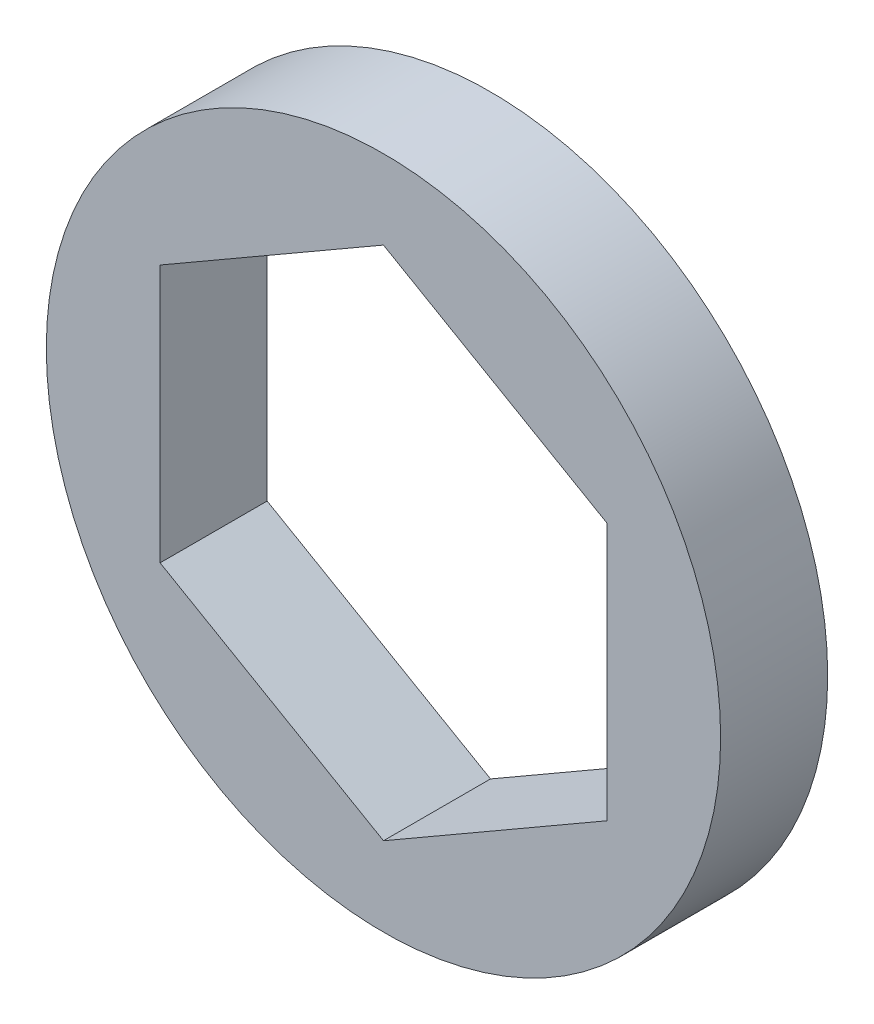
ISO-10303-21;
HEADER;
FILE_DESCRIPTION(('STEP AP214'),'2;1');
FILE_NAME('part.step','',(''),(''),'','','');
FILE_SCHEMA(('AUTOMOTIVE_DESIGN { 1 0 10303 214 1 1 1 1 }'));
ENDSEC;
DATA;
#1=APPLICATION_CONTEXT('core data for automotive mechanical design processes');
#2=APPLICATION_PROTOCOL_DEFINITION('international standard','automotive_design',2000,#1);
#3=PRODUCT_CONTEXT('',#1,'mechanical');
#4=PRODUCT('Part','Part','',(#3));
#5=PRODUCT_RELATED_PRODUCT_CATEGORY('part','',(#4));
#6=PRODUCT_DEFINITION_FORMATION('','',#4);
#7=PRODUCT_DEFINITION_CONTEXT('part definition',#1,'design');
#8=PRODUCT_DEFINITION('design','',#6,#7);
#9=PRODUCT_DEFINITION_SHAPE('','',#8);
#10=(LENGTH_UNIT() NAMED_UNIT(*) SI_UNIT(.MILLI.,.METRE.));
#11=(NAMED_UNIT(*) PLANE_ANGLE_UNIT() SI_UNIT($,.RADIAN.));
#12=(NAMED_UNIT(*) SI_UNIT($,.STERADIAN.) SOLID_ANGLE_UNIT());
#13=UNCERTAINTY_MEASURE_WITH_UNIT(LENGTH_MEASURE(1.E-05),#10,'distance_accuracy_value','');
#14=(GEOMETRIC_REPRESENTATION_CONTEXT(3) GLOBAL_UNCERTAINTY_ASSIGNED_CONTEXT((#13)) GLOBAL_UNIT_ASSIGNED_CONTEXT((#10,
#11,#12)) REPRESENTATION_CONTEXT('',''));
#15=CARTESIAN_POINT('',(0.,0.,0.));
#16=DIRECTION('',(0.,0.,1.));
#17=DIRECTION('',(1.,0.,0.));
#18=AXIS2_PLACEMENT_3D('',#15,#16,#17);
#19=CARTESIAN_POINT('',(0.,0.,1.6129));
#20=DIRECTION('',(0.,0.,1.));
#21=DIRECTION('',(1.,0.,0.));
#22=AXIS2_PLACEMENT_3D('',#19,#20,#21);
#23=PLANE('',#22);
#24=CARTESIAN_POINT('',(0.,0.,1.6129));
#25=DIRECTION('',(0.,0.,1.));
#26=DIRECTION('',(1.,0.,0.));
#27=AXIS2_PLACEMENT_3D('',#24,#25,#26);
#28=CIRCLE('',#27,10.16);
#29=CARTESIAN_POINT('',(10.16,0.,1.6129));
#30=VERTEX_POINT('',#29);
#31=EDGE_CURVE('E11',#30,#30,#28,.T.);
#32=ORIENTED_EDGE('',*,*,#31,.T.);
#33=EDGE_LOOP('',(#32));
#34=FACE_BOUND('',#33,.T.);
#35=DIRECTION('',(-0.866025403784439,-0.5,0.));
#36=VECTOR('',#35,1.);
#37=CARTESIAN_POINT('',(0.,7.77228932383074,1.6129));
#38=LINE('',#37,#36);
#39=CARTESIAN_POINT('',(0.,7.77228932383074,1.6129));
#40=VERTEX_POINT('',#39);
#41=CARTESIAN_POINT('',(-6.731,3.88614466191537,1.6129));
#42=VERTEX_POINT('',#41);
#43=EDGE_CURVE('E98',#40,#42,#38,.T.);
#44=ORIENTED_EDGE('',*,*,#43,.F.);
#45=DIRECTION('',(-0.866025403784439,0.5,0.));
#46=VECTOR('',#45,1.);
#47=CARTESIAN_POINT('',(6.731,3.88614466191537,1.6129));
#48=LINE('',#47,#46);
#49=CARTESIAN_POINT('',(6.731,3.88614466191537,1.6129));
#50=VERTEX_POINT('',#49);
#51=EDGE_CURVE('E90',#50,#40,#48,.T.);
#52=ORIENTED_EDGE('',*,*,#51,.F.);
#53=DIRECTION('',(0.,1.,0.));
#54=VECTOR('',#53,1.);
#55=CARTESIAN_POINT('',(6.731,-3.88614466191537,1.6129));
#56=LINE('',#55,#54);
#57=CARTESIAN_POINT('',(6.731,-3.88614466191537,1.6129));
#58=VERTEX_POINT('',#57);
#59=EDGE_CURVE('E118',#58,#50,#56,.T.);
#60=ORIENTED_EDGE('',*,*,#59,.F.);
#61=DIRECTION('',(0.866025403784439,0.5,0.));
#62=VECTOR('',#61,1.);
#63=CARTESIAN_POINT('',(0.,-7.77228932383074,1.6129));
#64=LINE('',#63,#62);
#65=CARTESIAN_POINT('',(0.,-7.77228932383074,1.6129));
#66=VERTEX_POINT('',#65);
#67=EDGE_CURVE('E116',#66,#58,#64,.T.);
#68=ORIENTED_EDGE('',*,*,#67,.F.);
#69=DIRECTION('',(0.866025403784439,-0.5,0.));
#70=VECTOR('',#69,1.);
#71=CARTESIAN_POINT('',(-6.731,-3.88614466191537,1.6129));
#72=LINE('',#71,#70);
#73=CARTESIAN_POINT('',(-6.731,-3.88614466191537,1.6129));
#74=VERTEX_POINT('',#73);
#75=EDGE_CURVE('E112',#74,#66,#72,.T.);
#76=ORIENTED_EDGE('',*,*,#75,.F.);
#77=DIRECTION('',(0.,-1.,0.));
#78=VECTOR('',#77,1.);
#79=CARTESIAN_POINT('',(-6.731,3.88614466191537,1.6129));
#80=LINE('',#79,#78);
#81=EDGE_CURVE('E110',#42,#74,#80,.T.);
#82=ORIENTED_EDGE('',*,*,#81,.F.);
#83=EDGE_LOOP('',(#44,#52,#60,#68,#76,#82));
#84=FACE_BOUND('',#83,.T.);
#85=ADVANCED_FACE('F37',(#34,#84),#23,.T.);
#86=CARTESIAN_POINT('',(0.,0.,-1.6129));
#87=DIRECTION('',(0.,0.,1.));
#88=DIRECTION('',(1.,0.,0.));
#89=AXIS2_PLACEMENT_3D('',#86,#87,#88);
#90=PLANE('',#89);
#91=CARTESIAN_POINT('',(0.,0.,-1.6129));
#92=DIRECTION('',(0.,0.,1.));
#93=DIRECTION('',(1.,0.,0.));
#94=AXIS2_PLACEMENT_3D('',#91,#92,#93);
#95=CIRCLE('',#94,10.16);
#96=CARTESIAN_POINT('',(10.16,0.,-1.6129));
#97=VERTEX_POINT('',#96);
#98=EDGE_CURVE('E41',#97,#97,#95,.T.);
#99=ORIENTED_EDGE('',*,*,#98,.F.);
#100=EDGE_LOOP('',(#99));
#101=FACE_BOUND('',#100,.T.);
#102=DIRECTION('',(-0.866025403784439,0.5,0.));
#103=VECTOR('',#102,1.);
#104=CARTESIAN_POINT('',(6.731,3.88614466191537,-1.6129));
#105=LINE('',#104,#103);
#106=CARTESIAN_POINT('',(6.731,3.88614466191537,-1.6129));
#107=VERTEX_POINT('',#106);
#108=CARTESIAN_POINT('',(0.,7.77228932383074,-1.6129));
#109=VERTEX_POINT('',#108);
#110=EDGE_CURVE('E60',#107,#109,#105,.T.);
#111=ORIENTED_EDGE('',*,*,#110,.T.);
#112=DIRECTION('',(-0.866025403784439,-0.5,0.));
#113=VECTOR('',#112,1.);
#114=CARTESIAN_POINT('',(0.,7.77228932383074,-1.6129));
#115=LINE('',#114,#113);
#116=CARTESIAN_POINT('',(-6.731,3.88614466191537,-1.6129));
#117=VERTEX_POINT('',#116);
#118=EDGE_CURVE('E105',#109,#117,#115,.T.);
#119=ORIENTED_EDGE('',*,*,#118,.T.);
#120=DIRECTION('',(0.,-1.,0.));
#121=VECTOR('',#120,1.);
#122=CARTESIAN_POINT('',(-6.731,3.88614466191537,-1.6129));
#123=LINE('',#122,#121);
#124=CARTESIAN_POINT('',(-6.731,-3.88614466191537,-1.6129));
#125=VERTEX_POINT('',#124);
#126=EDGE_CURVE('E122',#117,#125,#123,.T.);
#127=ORIENTED_EDGE('',*,*,#126,.T.);
#128=DIRECTION('',(0.866025403784439,-0.5,0.));
#129=VECTOR('',#128,1.);
#130=CARTESIAN_POINT('',(-6.731,-3.88614466191537,-1.6129));
#131=LINE('',#130,#129);
#132=CARTESIAN_POINT('',(0.,-7.77228932383074,-1.6129));
#133=VERTEX_POINT('',#132);
#134=EDGE_CURVE('E125',#125,#133,#131,.T.);
#135=ORIENTED_EDGE('',*,*,#134,.T.);
#136=DIRECTION('',(0.866025403784439,0.5,0.));
#137=VECTOR('',#136,1.);
#138=CARTESIAN_POINT('',(0.,-7.77228932383074,-1.6129));
#139=LINE('',#138,#137);
#140=CARTESIAN_POINT('',(6.731,-3.88614466191537,-1.6129));
#141=VERTEX_POINT('',#140);
#142=EDGE_CURVE('E128',#133,#141,#139,.T.);
#143=ORIENTED_EDGE('',*,*,#142,.T.);
#144=DIRECTION('',(0.,1.,0.));
#145=VECTOR('',#144,1.);
#146=CARTESIAN_POINT('',(6.731,-3.88614466191537,-1.6129));
#147=LINE('',#146,#145);
#148=EDGE_CURVE('E99',#141,#107,#147,.T.);
#149=ORIENTED_EDGE('',*,*,#148,.T.);
#150=EDGE_LOOP('',(#111,#119,#127,#135,#143,#149));
#151=FACE_BOUND('',#150,.T.);
#152=ADVANCED_FACE('F145',(#101,#151),#90,.F.);
#153=CARTESIAN_POINT('',(0.,0.,1.6129));
#154=DIRECTION('',(0.,0.,-1.));
#155=DIRECTION('',(-1.,0.,0.));
#156=AXIS2_PLACEMENT_3D('',#153,#154,#155);
#157=CYLINDRICAL_SURFACE('',#156,10.16);
#158=ORIENTED_EDGE('',*,*,#31,.F.);
#159=EDGE_LOOP('',(#158));
#160=FACE_BOUND('',#159,.T.);
#161=ORIENTED_EDGE('',*,*,#98,.T.);
#162=EDGE_LOOP('',(#161));
#163=FACE_BOUND('',#162,.T.);
#164=ADVANCED_FACE('F39',(#160,#163),#157,.T.);
#165=CARTESIAN_POINT('',(6.731,3.88614466191537,1.6129));
#166=DIRECTION('',(-0.5,-0.866025403784439,0.));
#167=DIRECTION('',(0.866025403784439,-0.5,0.));
#168=AXIS2_PLACEMENT_3D('',#165,#166,#167);
#169=PLANE('',#168);
#170=ORIENTED_EDGE('',*,*,#110,.F.);
#171=DIRECTION('',(0.,0.,-1.));
#172=VECTOR('',#171,1.);
#173=CARTESIAN_POINT('',(6.731,3.88614466191537,1.6129));
#174=LINE('',#173,#172);
#175=EDGE_CURVE('E94',#50,#107,#174,.T.);
#176=ORIENTED_EDGE('',*,*,#175,.F.);
#177=ORIENTED_EDGE('',*,*,#51,.T.);
#178=DIRECTION('',(0.,0.,-1.));
#179=VECTOR('',#178,1.);
#180=CARTESIAN_POINT('',(0.,7.77228932383074,1.6129));
#181=LINE('',#180,#179);
#182=EDGE_CURVE('E93',#40,#109,#181,.T.);
#183=ORIENTED_EDGE('',*,*,#182,.T.);
#184=EDGE_LOOP('',(#170,#176,#177,#183));
#185=FACE_BOUND('',#184,.T.);
#186=ADVANCED_FACE('F92',(#185),#169,.T.);
#187=CARTESIAN_POINT('',(0.,7.77228932383074,1.6129));
#188=DIRECTION('',(0.5,-0.866025403784439,0.));
#189=DIRECTION('',(0.866025403784439,0.5,0.));
#190=AXIS2_PLACEMENT_3D('',#187,#188,#189);
#191=PLANE('',#190);
#192=ORIENTED_EDGE('',*,*,#118,.F.);
#193=ORIENTED_EDGE('',*,*,#182,.F.);
#194=ORIENTED_EDGE('',*,*,#43,.T.);
#195=DIRECTION('',(0.,0.,-1.));
#196=VECTOR('',#195,1.);
#197=CARTESIAN_POINT('',(-6.731,3.88614466191537,1.6129));
#198=LINE('',#197,#196);
#199=EDGE_CURVE('E106',#42,#117,#198,.T.);
#200=ORIENTED_EDGE('',*,*,#199,.T.);
#201=EDGE_LOOP('',(#192,#193,#194,#200));
#202=FACE_BOUND('',#201,.T.);
#203=ADVANCED_FACE('F102',(#202),#191,.T.);
#204=CARTESIAN_POINT('',(-6.731,3.88614466191537,1.6129));
#205=DIRECTION('',(1.,0.,0.));
#206=DIRECTION('',(0.,1.,0.));
#207=AXIS2_PLACEMENT_3D('',#204,#205,#206);
#208=PLANE('',#207);
#209=ORIENTED_EDGE('',*,*,#126,.F.);
#210=ORIENTED_EDGE('',*,*,#199,.F.);
#211=ORIENTED_EDGE('',*,*,#81,.T.);
#212=DIRECTION('',(0.,0.,-1.));
#213=VECTOR('',#212,1.);
#214=CARTESIAN_POINT('',(-6.731,-3.88614466191537,1.6129));
#215=LINE('',#214,#213);
#216=EDGE_CURVE('E137',#74,#125,#215,.T.);
#217=ORIENTED_EDGE('',*,*,#216,.T.);
#218=EDGE_LOOP('',(#209,#210,#211,#217));
#219=FACE_BOUND('',#218,.T.);
#220=ADVANCED_FACE('F141',(#219),#208,.T.);
#221=CARTESIAN_POINT('',(-6.731,-3.88614466191537,1.6129));
#222=DIRECTION('',(0.5,0.866025403784439,0.));
#223=DIRECTION('',(-0.866025403784439,0.5,0.));
#224=AXIS2_PLACEMENT_3D('',#221,#222,#223);
#225=PLANE('',#224);
#226=ORIENTED_EDGE('',*,*,#134,.F.);
#227=ORIENTED_EDGE('',*,*,#216,.F.);
#228=ORIENTED_EDGE('',*,*,#75,.T.);
#229=DIRECTION('',(0.,0.,-1.));
#230=VECTOR('',#229,1.);
#231=CARTESIAN_POINT('',(0.,-7.77228932383074,1.6129));
#232=LINE('',#231,#230);
#233=EDGE_CURVE('E135',#66,#133,#232,.T.);
#234=ORIENTED_EDGE('',*,*,#233,.T.);
#235=EDGE_LOOP('',(#226,#227,#228,#234));
#236=FACE_BOUND('',#235,.T.);
#237=ADVANCED_FACE('F153',(#236),#225,.T.);
#238=CARTESIAN_POINT('',(0.,-7.77228932383074,1.6129));
#239=DIRECTION('',(-0.5,0.866025403784439,0.));
#240=DIRECTION('',(-0.866025403784439,-0.5,0.));
#241=AXIS2_PLACEMENT_3D('',#238,#239,#240);
#242=PLANE('',#241);
#243=ORIENTED_EDGE('',*,*,#142,.F.);
#244=ORIENTED_EDGE('',*,*,#233,.F.);
#245=ORIENTED_EDGE('',*,*,#67,.T.);
#246=DIRECTION('',(0.,0.,-1.));
#247=VECTOR('',#246,1.);
#248=CARTESIAN_POINT('',(6.731,-3.88614466191537,1.6129));
#249=LINE('',#248,#247);
#250=EDGE_CURVE('E52',#58,#141,#249,.T.);
#251=ORIENTED_EDGE('',*,*,#250,.T.);
#252=EDGE_LOOP('',(#243,#244,#245,#251));
#253=FACE_BOUND('',#252,.T.);
#254=ADVANCED_FACE('F151',(#253),#242,.T.);
#255=CARTESIAN_POINT('',(6.731,-3.88614466191537,1.6129));
#256=DIRECTION('',(-1.,0.,0.));
#257=DIRECTION('',(0.,-1.,0.));
#258=AXIS2_PLACEMENT_3D('',#255,#256,#257);
#259=PLANE('',#258);
#260=ORIENTED_EDGE('',*,*,#148,.F.);
#261=ORIENTED_EDGE('',*,*,#250,.F.);
#262=ORIENTED_EDGE('',*,*,#59,.T.);
#263=ORIENTED_EDGE('',*,*,#175,.T.);
#264=EDGE_LOOP('',(#260,#261,#262,#263));
#265=FACE_BOUND('',#264,.T.);
#266=ADVANCED_FACE('F147',(#265),#259,.T.);
#267=CLOSED_SHELL('',(#85,#152,#164,#186,#203,#220,#237,#254,#266));
#268=MANIFOLD_SOLID_BREP('B2',#267);
#269=ADVANCED_BREP_SHAPE_REPRESENTATION('',(#18,#268),#14);
#270=SHAPE_DEFINITION_REPRESENTATION(#9,#269);
ENDSEC;
END-ISO-10303-21;
